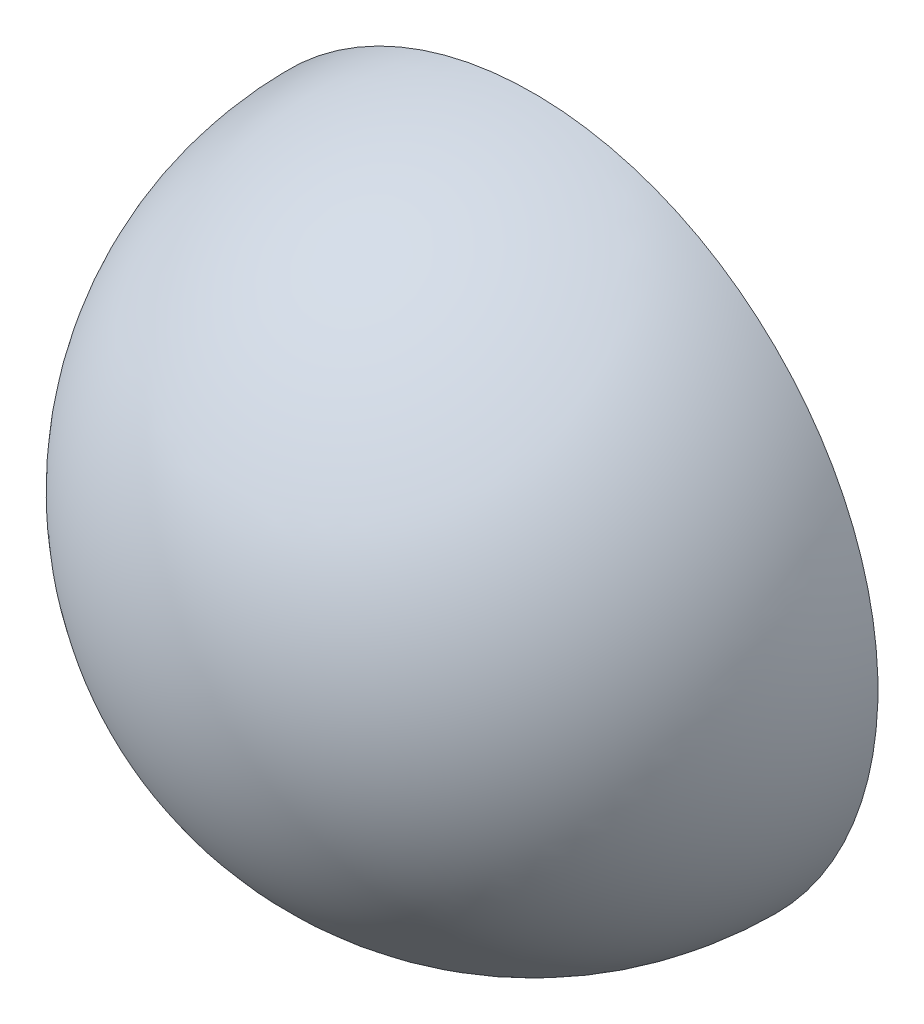
ISO-10303-21;
HEADER;
FILE_DESCRIPTION(('STEP AP214'),'2;1');
FILE_NAME('part.step','',(''),(''),'','','');
FILE_SCHEMA(('AUTOMOTIVE_DESIGN { 1 0 10303 214 1 1 1 1 }'));
ENDSEC;
DATA;
#1=APPLICATION_CONTEXT('core data for automotive mechanical design processes');
#2=APPLICATION_PROTOCOL_DEFINITION('international standard','automotive_design',2000,#1);
#3=PRODUCT_CONTEXT('',#1,'mechanical');
#4=PRODUCT('Part','Part','',(#3));
#5=PRODUCT_RELATED_PRODUCT_CATEGORY('part','',(#4));
#6=PRODUCT_DEFINITION_FORMATION('','',#4);
#7=PRODUCT_DEFINITION_CONTEXT('part definition',#1,'design');
#8=PRODUCT_DEFINITION('design','',#6,#7);
#9=PRODUCT_DEFINITION_SHAPE('','',#8);
#10=(LENGTH_UNIT() NAMED_UNIT(*) SI_UNIT(.MILLI.,.METRE.));
#11=(NAMED_UNIT(*) PLANE_ANGLE_UNIT() SI_UNIT($,.RADIAN.));
#12=(NAMED_UNIT(*) SI_UNIT($,.STERADIAN.) SOLID_ANGLE_UNIT());
#13=UNCERTAINTY_MEASURE_WITH_UNIT(LENGTH_MEASURE(1.E-05),#10,'distance_accuracy_value','');
#14=(GEOMETRIC_REPRESENTATION_CONTEXT(3) GLOBAL_UNCERTAINTY_ASSIGNED_CONTEXT((#13)) GLOBAL_UNIT_ASSIGNED_CONTEXT((#10,
#11,#12)) REPRESENTATION_CONTEXT('',''));
#15=CARTESIAN_POINT('',(0.,0.,0.));
#16=DIRECTION('',(0.,0.,1.));
#17=DIRECTION('',(1.,0.,0.));
#18=AXIS2_PLACEMENT_3D('',#15,#16,#17);
#19=CARTESIAN_POINT('',(0.,0.,0.));
#20=DIRECTION('',(0.,1.,0.));
#21=DIRECTION('',(-1.,0.,0.));
#22=AXIS2_PLACEMENT_3D('',#19,#20,#21);
#23=SPHERICAL_SURFACE('',#22,58.);
#24=CARTESIAN_POINT('',(0.,0.,0.));
#25=DIRECTION('',(0.,0.,1.));
#26=DIRECTION('',(-1.,0.,0.));
#27=AXIS2_PLACEMENT_3D('',#24,#25,#26);
#28=SPHERICAL_SURFACE('',#27,58.);
#29=CARTESIAN_POINT('',(0.,0.,0.));
#30=DIRECTION('',(0.,0.,1.));
#31=DIRECTION('',(-1.,0.,0.));
#32=AXIS2_PLACEMENT_3D('',#29,#30,#31);
#33=CIRCLE('',#32,58.);
#34=CARTESIAN_POINT('',(-58.,0.,-4.05011835305803E-13));
#35=VERTEX_POINT('',#34);
#36=EDGE_CURVE('E39',#35,#35,#33,.T.);
#37=ORIENTED_EDGE('',*,*,#36,.F.);
#38=EDGE_LOOP('',(#37));
#39=FACE_BOUND('',#38,.T.);
#40=ADVANCED_FACE('F32',(#39),#28,.F.);
#41=CARTESIAN_POINT('',(0.,0.,0.));
#42=DIRECTION('',(0.,1.,0.));
#43=DIRECTION('',(1.,0.,0.));
#44=AXIS2_PLACEMENT_3D('',#41,#42,#43);
#45=SPHERICAL_SURFACE('',#44,60.);
#46=CARTESIAN_POINT('',(0.,0.,0.));
#47=DIRECTION('',(0.,0.,-1.));
#48=DIRECTION('',(-1.,0.,0.));
#49=AXIS2_PLACEMENT_3D('',#46,#47,#48);
#50=SPHERICAL_SURFACE('',#49,60.);
#51=CARTESIAN_POINT('',(0.,0.,0.));
#52=DIRECTION('',(0.,0.,-1.));
#53=DIRECTION('',(-1.,0.,0.));
#54=AXIS2_PLACEMENT_3D('',#51,#52,#53);
#55=CIRCLE('',#54,60.);
#56=CARTESIAN_POINT('',(-60.,0.,-4.18977760661176E-13));
#57=VERTEX_POINT('',#56);
#58=EDGE_CURVE('E10',#57,#57,#55,.T.);
#59=ORIENTED_EDGE('',*,*,#58,.F.);
#60=EDGE_LOOP('',(#59));
#61=FACE_BOUND('',#60,.T.);
#62=ADVANCED_FACE('F34',(#61),#50,.T.);
#63=CARTESIAN_POINT('',(0.,0.,0.));
#64=DIRECTION('',(0.,0.,-1.));
#65=DIRECTION('',(-1.,0.,0.));
#66=AXIS2_PLACEMENT_3D('',#63,#64,#65);
#67=PLANE('',#66);
#68=ORIENTED_EDGE('',*,*,#58,.T.);
#69=EDGE_LOOP('',(#68));
#70=FACE_BOUND('',#69,.T.);
#71=ORIENTED_EDGE('',*,*,#36,.T.);
#72=EDGE_LOOP('',(#71));
#73=FACE_BOUND('',#72,.T.);
#74=ADVANCED_FACE('F45',(#70,#73),#67,.T.);
#75=CLOSED_SHELL('',(#40,#62,#74));
#76=MANIFOLD_SOLID_BREP('B2',#75);
#77=ADVANCED_BREP_SHAPE_REPRESENTATION('',(#18,#76),#14);
#78=SHAPE_DEFINITION_REPRESENTATION(#9,#77);
ENDSEC;
END-ISO-10303-21;
